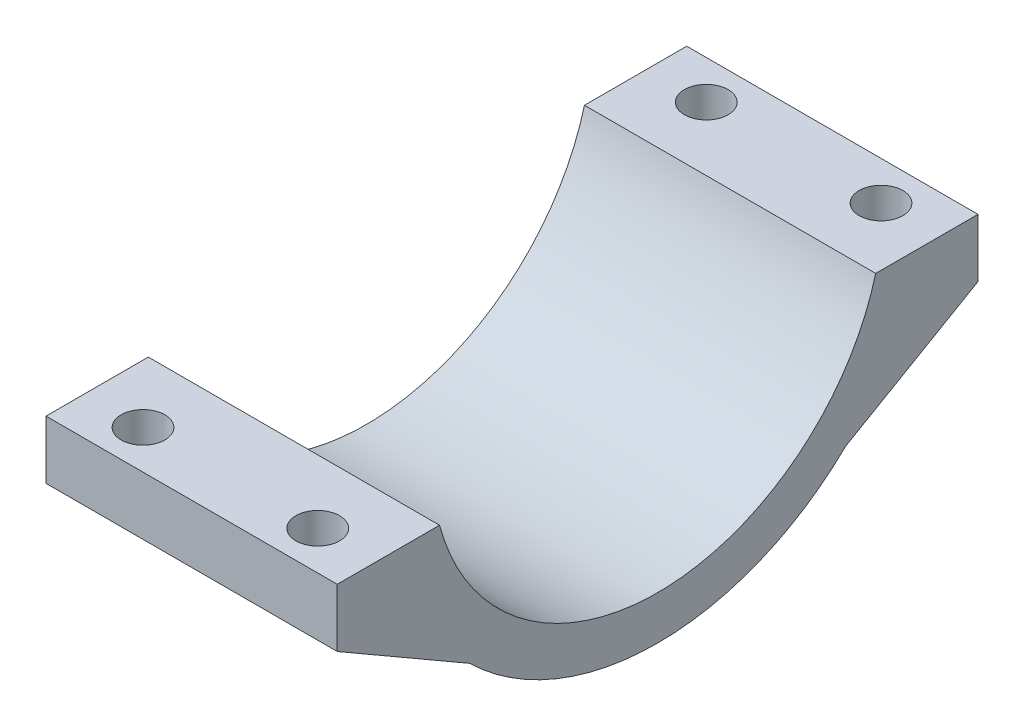
ISO-10303-21;
HEADER;
FILE_DESCRIPTION(('STEP AP214'),'2;1');
FILE_NAME('part.step','',(''),(''),'','','');
FILE_SCHEMA(('AUTOMOTIVE_DESIGN { 1 0 10303 214 1 1 1 1 }'));
ENDSEC;
DATA;
#1=APPLICATION_CONTEXT('core data for automotive mechanical design processes');
#2=APPLICATION_PROTOCOL_DEFINITION('international standard','automotive_design',2000,#1);
#3=PRODUCT_CONTEXT('',#1,'mechanical');
#4=PRODUCT('Part','Part','',(#3));
#5=PRODUCT_RELATED_PRODUCT_CATEGORY('part','',(#4));
#6=PRODUCT_DEFINITION_FORMATION('','',#4);
#7=PRODUCT_DEFINITION_CONTEXT('part definition',#1,'design');
#8=PRODUCT_DEFINITION('design','',#6,#7);
#9=PRODUCT_DEFINITION_SHAPE('','',#8);
#10=(LENGTH_UNIT() NAMED_UNIT(*) SI_UNIT(.MILLI.,.METRE.));
#11=(NAMED_UNIT(*) PLANE_ANGLE_UNIT() SI_UNIT($,.RADIAN.));
#12=(NAMED_UNIT(*) SI_UNIT($,.STERADIAN.) SOLID_ANGLE_UNIT());
#13=UNCERTAINTY_MEASURE_WITH_UNIT(LENGTH_MEASURE(1.E-05),#10,'distance_accuracy_value','');
#14=(GEOMETRIC_REPRESENTATION_CONTEXT(3) GLOBAL_UNCERTAINTY_ASSIGNED_CONTEXT((#13)) GLOBAL_UNIT_ASSIGNED_CONTEXT((#10,
#11,#12)) REPRESENTATION_CONTEXT('',''));
#15=CARTESIAN_POINT('',(0.,0.,0.));
#16=DIRECTION('',(0.,0.,1.));
#17=DIRECTION('',(1.,0.,0.));
#18=AXIS2_PLACEMENT_3D('',#15,#16,#17);
#19=CARTESIAN_POINT('',(20.,-8.,-16.6808273176123));
#20=DIRECTION('',(0.,1.,0.));
#21=DIRECTION('',(0.,0.,1.));
#22=AXIS2_PLACEMENT_3D('',#19,#20,#21);
#23=PLANE('',#22);
#24=CARTESIAN_POINT('',(16.,-8.,-19.3404136588061));
#25=DIRECTION('',(0.,-1.,0.));
#26=DIRECTION('',(0.,0.,-1.));
#27=AXIS2_PLACEMENT_3D('',#24,#25,#26);
#28=CIRCLE('',#27,1.5);
#29=CARTESIAN_POINT('',(16.,-8.,-20.8404136588061));
#30=VERTEX_POINT('',#29);
#31=EDGE_CURVE('E339',#30,#30,#28,.T.);
#32=ORIENTED_EDGE('',*,*,#31,.F.);
#33=EDGE_LOOP('',(#32));
#34=FACE_BOUND('',#33,.T.);
#35=DIRECTION('',(0.,0.,-1.));
#36=VECTOR('',#35,1.);
#37=CARTESIAN_POINT('',(18.8,-8.,-16.6808273176123));
#38=LINE('',#37,#36);
#39=CARTESIAN_POINT('',(18.8,-8.,-16.6808273176123));
#40=VERTEX_POINT('',#39);
#41=CARTESIAN_POINT('',(18.8,-8.,-22.));
#42=VERTEX_POINT('',#41);
#43=EDGE_CURVE('E173',#40,#42,#38,.T.);
#44=ORIENTED_EDGE('',*,*,#43,.F.);
#45=DIRECTION('',(-1.,0.,0.));
#46=VECTOR('',#45,1.);
#47=CARTESIAN_POINT('',(20.,-8.00000000000001,-16.6808273176123));
#48=LINE('',#47,#46);
#49=CARTESIAN_POINT('',(13.,-8.00000000000001,-16.6808273176123));
#50=VERTEX_POINT('',#49);
#51=EDGE_CURVE('E225',#40,#50,#48,.T.);
#52=ORIENTED_EDGE('',*,*,#51,.T.);
#53=DIRECTION('',(0.,0.,1.));
#54=VECTOR('',#53,1.);
#55=CARTESIAN_POINT('',(13.,-8.,-16.6808273176123));
#56=LINE('',#55,#54);
#57=CARTESIAN_POINT('',(13.,-7.99999999999999,-22.));
#58=VERTEX_POINT('',#57);
#59=EDGE_CURVE('E194',#58,#50,#56,.T.);
#60=ORIENTED_EDGE('',*,*,#59,.F.);
#61=DIRECTION('',(-1.,0.,0.));
#62=VECTOR('',#61,1.);
#63=CARTESIAN_POINT('',(20.,-7.99999999999999,-22.));
#64=LINE('',#63,#62);
#65=EDGE_CURVE('E57',#42,#58,#64,.T.);
#66=ORIENTED_EDGE('',*,*,#65,.F.);
#67=EDGE_LOOP('',(#44,#52,#60,#66));
#68=FACE_BOUND('',#67,.T.);
#69=ADVANCED_FACE('F33',(#34,#68),#23,.F.);
#70=CARTESIAN_POINT('',(4.,-8.,-19.3404136588061));
#71=DIRECTION('',(0.,-1.,0.));
#72=DIRECTION('',(0.,0.,-1.));
#73=AXIS2_PLACEMENT_3D('',#70,#71,#72);
#74=CIRCLE('',#73,1.5);
#75=CARTESIAN_POINT('',(4.,-8.,-20.8404136588061));
#76=VERTEX_POINT('',#75);
#77=EDGE_CURVE('E336',#76,#76,#74,.T.);
#78=ORIENTED_EDGE('',*,*,#77,.F.);
#79=EDGE_LOOP('',(#78));
#80=FACE_BOUND('',#79,.T.);
#81=CARTESIAN_POINT('',(7.,-7.99999999999999,-22.));
#82=VERTEX_POINT('',#81);
#83=CARTESIAN_POINT('',(1.2,-7.99999999999999,-22.));
#84=VERTEX_POINT('',#83);
#85=EDGE_CURVE('E50',#82,#84,#64,.T.);
#86=ORIENTED_EDGE('',*,*,#85,.F.);
#87=DIRECTION('',(0.,0.,1.));
#88=VECTOR('',#87,1.);
#89=CARTESIAN_POINT('',(7.,-8.,-16.6808273176123));
#90=LINE('',#89,#88);
#91=CARTESIAN_POINT('',(7.,-8.00000000000001,-16.6808273176123));
#92=VERTEX_POINT('',#91);
#93=EDGE_CURVE('E320',#82,#92,#90,.T.);
#94=ORIENTED_EDGE('',*,*,#93,.T.);
#95=CARTESIAN_POINT('',(1.2,-8.00000000000001,-16.6808273176123));
#96=VERTEX_POINT('',#95);
#97=EDGE_CURVE('E227',#92,#96,#48,.T.);
#98=ORIENTED_EDGE('',*,*,#97,.T.);
#99=DIRECTION('',(0.,0.,1.));
#100=VECTOR('',#99,1.);
#101=CARTESIAN_POINT('',(1.2,-8.,-16.6808273176123));
#102=LINE('',#101,#100);
#103=EDGE_CURVE('E306',#84,#96,#102,.T.);
#104=ORIENTED_EDGE('',*,*,#103,.F.);
#105=EDGE_LOOP('',(#86,#94,#98,#104));
#106=FACE_BOUND('',#105,.T.);
#107=ADVANCED_FACE('F35',(#80,#106),#23,.F.);
#108=CARTESIAN_POINT('',(20.,-8.,22.));
#109=DIRECTION('',(0.,1.,0.));
#110=DIRECTION('',(0.,0.,1.));
#111=AXIS2_PLACEMENT_3D('',#108,#109,#110);
#112=PLANE('',#111);
#113=CARTESIAN_POINT('',(16.,-8.,19.3404136588061));
#114=DIRECTION('',(0.,-1.,0.));
#115=DIRECTION('',(0.,0.,-1.));
#116=AXIS2_PLACEMENT_3D('',#113,#114,#115);
#117=CIRCLE('',#116,1.5);
#118=CARTESIAN_POINT('',(16.,-8.,17.8404136588061));
#119=VERTEX_POINT('',#118);
#120=EDGE_CURVE('E297',#119,#119,#117,.T.);
#121=ORIENTED_EDGE('',*,*,#120,.F.);
#122=EDGE_LOOP('',(#121));
#123=FACE_BOUND('',#122,.T.);
#124=DIRECTION('',(0.,0.,-1.));
#125=VECTOR('',#124,1.);
#126=CARTESIAN_POINT('',(18.8,-8.,22.));
#127=LINE('',#126,#125);
#128=CARTESIAN_POINT('',(18.8,-8.,22.));
#129=VERTEX_POINT('',#128);
#130=CARTESIAN_POINT('',(18.8,-8.,16.6808273176123));
#131=VERTEX_POINT('',#130);
#132=EDGE_CURVE('E280',#129,#131,#127,.T.);
#133=ORIENTED_EDGE('',*,*,#132,.F.);
#134=DIRECTION('',(-1.,0.,0.));
#135=VECTOR('',#134,1.);
#136=CARTESIAN_POINT('',(20.,-8.,22.));
#137=LINE('',#136,#135);
#138=CARTESIAN_POINT('',(13.,-8.,22.));
#139=VERTEX_POINT('',#138);
#140=EDGE_CURVE('E220',#129,#139,#137,.T.);
#141=ORIENTED_EDGE('',*,*,#140,.T.);
#142=DIRECTION('',(0.,0.,1.));
#143=VECTOR('',#142,1.);
#144=CARTESIAN_POINT('',(13.,-8.,22.));
#145=LINE('',#144,#143);
#146=CARTESIAN_POINT('',(13.,-8.,16.6808273176123));
#147=VERTEX_POINT('',#146);
#148=EDGE_CURVE('E273',#147,#139,#145,.T.);
#149=ORIENTED_EDGE('',*,*,#148,.F.);
#150=DIRECTION('',(-1.,0.,0.));
#151=VECTOR('',#150,1.);
#152=CARTESIAN_POINT('',(20.,-8.,16.6808273176123));
#153=LINE('',#152,#151);
#154=EDGE_CURVE('E222',#131,#147,#153,.T.);
#155=ORIENTED_EDGE('',*,*,#154,.F.);
#156=EDGE_LOOP('',(#133,#141,#149,#155));
#157=FACE_BOUND('',#156,.T.);
#158=ADVANCED_FACE('F363',(#123,#157),#112,.F.);
#159=CARTESIAN_POINT('',(4.,-8.,19.3404136588061));
#160=DIRECTION('',(0.,-1.,0.));
#161=DIRECTION('',(0.,0.,-1.));
#162=AXIS2_PLACEMENT_3D('',#159,#160,#161);
#163=CIRCLE('',#162,1.5);
#164=CARTESIAN_POINT('',(4.,-8.,17.8404136588061));
#165=VERTEX_POINT('',#164);
#166=EDGE_CURVE('E293',#165,#165,#163,.T.);
#167=ORIENTED_EDGE('',*,*,#166,.F.);
#168=EDGE_LOOP('',(#167));
#169=FACE_BOUND('',#168,.T.);
#170=CARTESIAN_POINT('',(7.,-8.,16.6808273176123));
#171=VERTEX_POINT('',#170);
#172=CARTESIAN_POINT('',(1.2,-8.,16.6808273176123));
#173=VERTEX_POINT('',#172);
#174=EDGE_CURVE('E224',#171,#173,#153,.T.);
#175=ORIENTED_EDGE('',*,*,#174,.F.);
#176=DIRECTION('',(0.,0.,1.));
#177=VECTOR('',#176,1.);
#178=CARTESIAN_POINT('',(7.,-8.,22.));
#179=LINE('',#178,#177);
#180=CARTESIAN_POINT('',(7.,-8.,22.));
#181=VERTEX_POINT('',#180);
#182=EDGE_CURVE('E271',#171,#181,#179,.T.);
#183=ORIENTED_EDGE('',*,*,#182,.T.);
#184=CARTESIAN_POINT('',(1.2,-8.,22.));
#185=VERTEX_POINT('',#184);
#186=EDGE_CURVE('E221',#181,#185,#137,.T.);
#187=ORIENTED_EDGE('',*,*,#186,.T.);
#188=DIRECTION('',(0.,0.,1.));
#189=VECTOR('',#188,1.);
#190=CARTESIAN_POINT('',(1.2,-8.,22.));
#191=LINE('',#190,#189);
#192=EDGE_CURVE('E242',#173,#185,#191,.T.);
#193=ORIENTED_EDGE('',*,*,#192,.F.);
#194=EDGE_LOOP('',(#175,#183,#187,#193));
#195=FACE_BOUND('',#194,.T.);
#196=ADVANCED_FACE('F368',(#169,#195),#112,.F.);
#197=CARTESIAN_POINT('',(20.,-3.99999999999999,-22.));
#198=DIRECTION('',(0.,0.,1.));
#199=DIRECTION('',(1.,0.,0.));
#200=AXIS2_PLACEMENT_3D('',#197,#198,#199);
#201=PLANE('',#200);
#202=CARTESIAN_POINT('',(20.,-7.99999999999999,-22.));
#203=VERTEX_POINT('',#202);
#204=EDGE_CURVE('E187',#203,#42,#64,.T.);
#205=ORIENTED_EDGE('',*,*,#204,.T.);
#206=ORIENTED_EDGE('',*,*,#65,.T.);
#207=DIRECTION('',(1.,0.,0.));
#208=VECTOR('',#207,1.);
#209=CARTESIAN_POINT('',(20.,-8.,-22.));
#210=LINE('',#209,#208);
#211=EDGE_CURVE('E315',#82,#58,#210,.T.);
#212=ORIENTED_EDGE('',*,*,#211,.F.);
#213=ORIENTED_EDGE('',*,*,#85,.T.);
#214=DIRECTION('',(1.,0.,0.));
#215=VECTOR('',#214,1.);
#216=CARTESIAN_POINT('',(20.,-8.,-22.));
#217=LINE('',#216,#215);
#218=CARTESIAN_POINT('',(0.,-7.99999999999999,-22.));
#219=VERTEX_POINT('',#218);
#220=EDGE_CURVE('E300',#219,#84,#217,.T.);
#221=ORIENTED_EDGE('',*,*,#220,.F.);
#222=DIRECTION('',(0.,1.,0.));
#223=VECTOR('',#222,1.);
#224=CARTESIAN_POINT('',(0.,-3.99999999999999,-22.));
#225=LINE('',#224,#223);
#226=CARTESIAN_POINT('',(0.,-3.99999999999999,-22.));
#227=VERTEX_POINT('',#226);
#228=EDGE_CURVE('E240',#219,#227,#225,.T.);
#229=ORIENTED_EDGE('',*,*,#228,.T.);
#230=DIRECTION('',(-1.,0.,0.));
#231=VECTOR('',#230,1.);
#232=CARTESIAN_POINT('',(20.,-3.99999999999999,-22.));
#233=LINE('',#232,#231);
#234=CARTESIAN_POINT('',(20.,-3.99999999999999,-22.));
#235=VERTEX_POINT('',#234);
#236=EDGE_CURVE('E205',#235,#227,#233,.T.);
#237=ORIENTED_EDGE('',*,*,#236,.F.);
#238=DIRECTION('',(0.,1.,0.));
#239=VECTOR('',#238,1.);
#240=CARTESIAN_POINT('',(20.,-3.99999999999999,-22.));
#241=LINE('',#240,#239);
#242=EDGE_CURVE('E199',#203,#235,#241,.T.);
#243=ORIENTED_EDGE('',*,*,#242,.F.);
#244=EDGE_LOOP('',(#205,#206,#212,#213,#221,#229,#237,#243));
#245=FACE_BOUND('',#244,.T.);
#246=ADVANCED_FACE('F197',(#245),#201,.F.);
#247=CARTESIAN_POINT('',(20.,-3.99999999999999,-14.9749791318719));
#248=DIRECTION('',(0.,-1.,0.));
#249=DIRECTION('',(0.,0.,-1.));
#250=AXIS2_PLACEMENT_3D('',#247,#248,#249);
#251=PLANE('',#250);
#252=CARTESIAN_POINT('',(16.,-3.99999999999999,-19.3404136588061));
#253=DIRECTION('',(0.,-1.,0.));
#254=DIRECTION('',(0.,0.,-1.));
#255=AXIS2_PLACEMENT_3D('',#252,#253,#254);
#256=CIRCLE('',#255,1.5);
#257=CARTESIAN_POINT('',(16.,-3.99999999999999,-20.8404136588061));
#258=VERTEX_POINT('',#257);
#259=EDGE_CURVE('E37',#258,#258,#256,.T.);
#260=ORIENTED_EDGE('',*,*,#259,.T.);
#261=EDGE_LOOP('',(#260));
#262=FACE_BOUND('',#261,.T.);
#263=CARTESIAN_POINT('',(4.,-3.99999999999999,-19.3404136588061));
#264=DIRECTION('',(0.,-1.,0.));
#265=DIRECTION('',(0.,0.,-1.));
#266=AXIS2_PLACEMENT_3D('',#263,#264,#265);
#267=CIRCLE('',#266,1.5);
#268=CARTESIAN_POINT('',(4.,-3.99999999999999,-20.8404136588061));
#269=VERTEX_POINT('',#268);
#270=EDGE_CURVE('E191',#269,#269,#267,.T.);
#271=ORIENTED_EDGE('',*,*,#270,.T.);
#272=EDGE_LOOP('',(#271));
#273=FACE_BOUND('',#272,.T.);
#274=ORIENTED_EDGE('',*,*,#236,.T.);
#275=DIRECTION('',(0.,0.,1.));
#276=VECTOR('',#275,1.);
#277=CARTESIAN_POINT('',(0.,-3.99999999999999,-14.9749791318719));
#278=LINE('',#277,#276);
#279=CARTESIAN_POINT('',(0.,-3.99999999999999,-14.9749791318719));
#280=VERTEX_POINT('',#279);
#281=EDGE_CURVE('E238',#227,#280,#278,.T.);
#282=ORIENTED_EDGE('',*,*,#281,.T.);
#283=DIRECTION('',(-1.,0.,0.));
#284=VECTOR('',#283,1.);
#285=CARTESIAN_POINT('',(20.,-3.99999999999999,-14.9749791318719));
#286=LINE('',#285,#284);
#287=CARTESIAN_POINT('',(20.,-3.99999999999999,-14.9749791318719));
#288=VERTEX_POINT('',#287);
#289=EDGE_CURVE('E207',#288,#280,#286,.T.);
#290=ORIENTED_EDGE('',*,*,#289,.F.);
#291=DIRECTION('',(0.,0.,1.));
#292=VECTOR('',#291,1.);
#293=CARTESIAN_POINT('',(20.,-3.99999999999999,-14.9749791318719));
#294=LINE('',#293,#292);
#295=EDGE_CURVE('E252',#235,#288,#294,.T.);
#296=ORIENTED_EDGE('',*,*,#295,.F.);
#297=EDGE_LOOP('',(#274,#282,#290,#296));
#298=FACE_BOUND('',#297,.T.);
#299=ADVANCED_FACE('F346',(#262,#273,#298),#251,.F.);
#300=CARTESIAN_POINT('',(20.,0.,0.));
#301=DIRECTION('',(-1.,0.,0.));
#302=DIRECTION('',(0.,0.,1.));
#303=AXIS2_PLACEMENT_3D('',#300,#301,#302);
#304=CYLINDRICAL_SURFACE('',#303,15.5);
#305=ORIENTED_EDGE('',*,*,#289,.T.);
#306=CARTESIAN_POINT('',(0.,0.,0.));
#307=DIRECTION('',(-1.,0.,0.));
#308=DIRECTION('',(0.,0.,-1.));
#309=AXIS2_PLACEMENT_3D('',#306,#307,#308);
#310=CIRCLE('',#309,15.5);
#311=CARTESIAN_POINT('',(0.,-3.99999999999999,14.9749791318719));
#312=VERTEX_POINT('',#311);
#313=EDGE_CURVE('E235',#280,#312,#310,.T.);
#314=ORIENTED_EDGE('',*,*,#313,.T.);
#315=DIRECTION('',(-1.,0.,0.));
#316=VECTOR('',#315,1.);
#317=CARTESIAN_POINT('',(20.,-3.99999999999999,14.9749791318719));
#318=LINE('',#317,#316);
#319=CARTESIAN_POINT('',(20.,-3.99999999999999,14.9749791318719));
#320=VERTEX_POINT('',#319);
#321=EDGE_CURVE('E212',#320,#312,#318,.T.);
#322=ORIENTED_EDGE('',*,*,#321,.F.);
#323=CARTESIAN_POINT('',(20.,0.,0.));
#324=DIRECTION('',(-1.,0.,0.));
#325=DIRECTION('',(0.,0.,-1.));
#326=AXIS2_PLACEMENT_3D('',#323,#324,#325);
#327=CIRCLE('',#326,15.5);
#328=EDGE_CURVE('E250',#288,#320,#327,.T.);
#329=ORIENTED_EDGE('',*,*,#328,.F.);
#330=EDGE_LOOP('',(#305,#314,#322,#329));
#331=FACE_BOUND('',#330,.T.);
#332=ADVANCED_FACE('F498',(#331),#304,.F.);
#333=CARTESIAN_POINT('',(20.,-4.,22.));
#334=DIRECTION('',(0.,-1.,0.));
#335=DIRECTION('',(0.,0.,-1.));
#336=AXIS2_PLACEMENT_3D('',#333,#334,#335);
#337=PLANE('',#336);
#338=ORIENTED_EDGE('',*,*,#321,.T.);
#339=DIRECTION('',(0.,0.,1.));
#340=VECTOR('',#339,1.);
#341=CARTESIAN_POINT('',(0.,-4.,22.));
#342=LINE('',#341,#340);
#343=CARTESIAN_POINT('',(0.,-4.,22.));
#344=VERTEX_POINT('',#343);
#345=EDGE_CURVE('E232',#312,#344,#342,.T.);
#346=ORIENTED_EDGE('',*,*,#345,.T.);
#347=DIRECTION('',(-1.,0.,0.));
#348=VECTOR('',#347,1.);
#349=CARTESIAN_POINT('',(20.,-4.,22.));
#350=LINE('',#349,#348);
#351=CARTESIAN_POINT('',(20.,-4.,22.));
#352=VERTEX_POINT('',#351);
#353=EDGE_CURVE('E216',#352,#344,#350,.T.);
#354=ORIENTED_EDGE('',*,*,#353,.F.);
#355=DIRECTION('',(0.,0.,1.));
#356=VECTOR('',#355,1.);
#357=CARTESIAN_POINT('',(20.,-4.,22.));
#358=LINE('',#357,#356);
#359=EDGE_CURVE('E248',#320,#352,#358,.T.);
#360=ORIENTED_EDGE('',*,*,#359,.F.);
#361=EDGE_LOOP('',(#338,#346,#354,#360));
#362=FACE_BOUND('',#361,.T.);
#363=CARTESIAN_POINT('',(16.,-4.,19.3404136588061));
#364=DIRECTION('',(0.,-1.,0.));
#365=DIRECTION('',(0.,0.,-1.));
#366=AXIS2_PLACEMENT_3D('',#363,#364,#365);
#367=CIRCLE('',#366,1.5);
#368=CARTESIAN_POINT('',(16.,-4.,17.8404136588061));
#369=VERTEX_POINT('',#368);
#370=EDGE_CURVE('E296',#369,#369,#367,.T.);
#371=ORIENTED_EDGE('',*,*,#370,.T.);
#372=EDGE_LOOP('',(#371));
#373=FACE_BOUND('',#372,.T.);
#374=CARTESIAN_POINT('',(4.,-4.,19.3404136588061));
#375=DIRECTION('',(0.,-1.,0.));
#376=DIRECTION('',(0.,0.,-1.));
#377=AXIS2_PLACEMENT_3D('',#374,#375,#376);
#378=CIRCLE('',#377,1.5);
#379=CARTESIAN_POINT('',(4.,-4.,17.8404136588061));
#380=VERTEX_POINT('',#379);
#381=EDGE_CURVE('E291',#380,#380,#378,.T.);
#382=ORIENTED_EDGE('',*,*,#381,.T.);
#383=EDGE_LOOP('',(#382));
#384=FACE_BOUND('',#383,.T.);
#385=ADVANCED_FACE('F494',(#362,#373,#384),#337,.F.);
#386=CARTESIAN_POINT('',(20.,-4.,22.));
#387=DIRECTION('',(0.,0.,-1.));
#388=DIRECTION('',(-1.,0.,0.));
#389=AXIS2_PLACEMENT_3D('',#386,#387,#388);
#390=PLANE('',#389);
#391=ORIENTED_EDGE('',*,*,#353,.T.);
#392=DIRECTION('',(0.,-1.,0.));
#393=VECTOR('',#392,1.);
#394=CARTESIAN_POINT('',(0.,-4.,22.));
#395=LINE('',#394,#393);
#396=CARTESIAN_POINT('',(0.,-8.,22.));
#397=VERTEX_POINT('',#396);
#398=EDGE_CURVE('E230',#344,#397,#395,.T.);
#399=ORIENTED_EDGE('',*,*,#398,.T.);
#400=DIRECTION('',(-1.,0.,0.));
#401=VECTOR('',#400,1.);
#402=CARTESIAN_POINT('',(20.,-8.,22.));
#403=LINE('',#402,#401);
#404=EDGE_CURVE('E257',#397,#185,#403,.F.);
#405=ORIENTED_EDGE('',*,*,#404,.T.);
#406=ORIENTED_EDGE('',*,*,#186,.F.);
#407=DIRECTION('',(1.,0.,0.));
#408=VECTOR('',#407,1.);
#409=CARTESIAN_POINT('',(20.,-8.,22.));
#410=LINE('',#409,#408);
#411=EDGE_CURVE('E266',#139,#181,#410,.F.);
#412=ORIENTED_EDGE('',*,*,#411,.F.);
#413=ORIENTED_EDGE('',*,*,#140,.F.);
#414=CARTESIAN_POINT('',(20.,-8.,22.));
#415=VERTEX_POINT('',#414);
#416=EDGE_CURVE('E218',#415,#129,#137,.T.);
#417=ORIENTED_EDGE('',*,*,#416,.F.);
#418=DIRECTION('',(0.,-1.,0.));
#419=VECTOR('',#418,1.);
#420=CARTESIAN_POINT('',(20.,-4.,22.));
#421=LINE('',#420,#419);
#422=EDGE_CURVE('E245',#352,#415,#421,.T.);
#423=ORIENTED_EDGE('',*,*,#422,.F.);
#424=EDGE_LOOP('',(#391,#399,#405,#406,#412,#413,#417,#423));
#425=FACE_BOUND('',#424,.T.);
#426=ADVANCED_FACE('F488',(#425),#390,.F.);
#427=CARTESIAN_POINT('',(20.,0.,0.));
#428=DIRECTION('',(-1.,0.,0.));
#429=DIRECTION('',(0.,0.,1.));
#430=AXIS2_PLACEMENT_3D('',#427,#428,#429);
#431=CYLINDRICAL_SURFACE('',#430,18.5);
#432=DIRECTION('',(-1.,0.,0.));
#433=VECTOR('',#432,1.);
#434=CARTESIAN_POINT('',(20.,-13.2443105037411,-12.9165877568533));
#435=LINE('',#434,#433);
#436=CARTESIAN_POINT('',(18.8,-13.2443105037411,-12.9165877568533));
#437=VERTEX_POINT('',#436);
#438=CARTESIAN_POINT('',(20.,-13.2443105037411,-12.9165877568533));
#439=VERTEX_POINT('',#438);
#440=EDGE_CURVE('E190',#437,#439,#435,.F.);
#441=ORIENTED_EDGE('',*,*,#440,.T.);
#442=CARTESIAN_POINT('',(20.,0.,0.));
#443=DIRECTION('',(1.,0.,0.));
#444=DIRECTION('',(0.,0.,-1.));
#445=AXIS2_PLACEMENT_3D('',#442,#443,#444);
#446=CIRCLE('',#445,18.5);
#447=CARTESIAN_POINT('',(20.,-13.2443105037411,12.9165877568533));
#448=VERTEX_POINT('',#447);
#449=EDGE_CURVE('E243',#448,#439,#446,.T.);
#450=ORIENTED_EDGE('',*,*,#449,.F.);
#451=DIRECTION('',(-1.,0.,0.));
#452=VECTOR('',#451,1.);
#453=CARTESIAN_POINT('',(20.,-13.2443105037411,12.9165877568533));
#454=LINE('',#453,#452);
#455=CARTESIAN_POINT('',(18.8,-13.2443105037411,12.9165877568533));
#456=VERTEX_POINT('',#455);
#457=EDGE_CURVE('E284',#448,#456,#454,.T.);
#458=ORIENTED_EDGE('',*,*,#457,.T.);
#459=CARTESIAN_POINT('',(18.8,0.,0.));
#460=DIRECTION('',(1.,0.,0.));
#461=DIRECTION('',(0.,0.,-1.));
#462=AXIS2_PLACEMENT_3D('',#459,#460,#461);
#463=CIRCLE('',#462,18.5);
#464=EDGE_CURVE('E42',#131,#456,#463,.T.);
#465=ORIENTED_EDGE('',*,*,#464,.F.);
#466=ORIENTED_EDGE('',*,*,#154,.T.);
#467=CARTESIAN_POINT('',(13.,0.,0.));
#468=DIRECTION('',(-1.,0.,0.));
#469=DIRECTION('',(0.,0.,1.));
#470=AXIS2_PLACEMENT_3D('',#467,#468,#469);
#471=CIRCLE('',#470,18.5);
#472=CARTESIAN_POINT('',(13.,-13.2443105037411,12.9165877568533));
#473=VERTEX_POINT('',#472);
#474=EDGE_CURVE('E202',#473,#147,#471,.T.);
#475=ORIENTED_EDGE('',*,*,#474,.F.);
#476=DIRECTION('',(-1.,0.,0.));
#477=VECTOR('',#476,1.);
#478=CARTESIAN_POINT('',(20.,-13.2443105037411,12.9165877568533));
#479=LINE('',#478,#477);
#480=CARTESIAN_POINT('',(7.,-13.2443105037411,12.9165877568533));
#481=VERTEX_POINT('',#480);
#482=EDGE_CURVE('E383',#473,#481,#479,.T.);
#483=ORIENTED_EDGE('',*,*,#482,.T.);
#484=CARTESIAN_POINT('',(7.,0.,0.));
#485=DIRECTION('',(-1.,0.,0.));
#486=DIRECTION('',(0.,0.,1.));
#487=AXIS2_PLACEMENT_3D('',#484,#485,#486);
#488=CIRCLE('',#487,18.5);
#489=EDGE_CURVE('E381',#481,#171,#488,.T.);
#490=ORIENTED_EDGE('',*,*,#489,.T.);
#491=ORIENTED_EDGE('',*,*,#174,.T.);
#492=CARTESIAN_POINT('',(1.2,0.,0.));
#493=DIRECTION('',(-1.,0.,0.));
#494=DIRECTION('',(0.,0.,1.));
#495=AXIS2_PLACEMENT_3D('',#492,#493,#494);
#496=CIRCLE('',#495,18.5);
#497=CARTESIAN_POINT('',(1.2,-13.2443105037411,12.9165877568533));
#498=VERTEX_POINT('',#497);
#499=EDGE_CURVE('E200',#498,#173,#496,.T.);
#500=ORIENTED_EDGE('',*,*,#499,.F.);
#501=DIRECTION('',(-1.,0.,0.));
#502=VECTOR('',#501,1.);
#503=CARTESIAN_POINT('',(20.,-13.2443105037411,12.9165877568533));
#504=LINE('',#503,#502);
#505=CARTESIAN_POINT('',(0.,-13.2443105037411,12.9165877568533));
#506=VERTEX_POINT('',#505);
#507=EDGE_CURVE('E260',#498,#506,#504,.T.);
#508=ORIENTED_EDGE('',*,*,#507,.T.);
#509=CARTESIAN_POINT('',(0.,0.,0.));
#510=DIRECTION('',(1.,0.,0.));
#511=DIRECTION('',(0.,0.,-1.));
#512=AXIS2_PLACEMENT_3D('',#509,#510,#511);
#513=CIRCLE('',#512,18.5);
#514=CARTESIAN_POINT('',(0.,-13.2443105037411,-12.9165877568533));
#515=VERTEX_POINT('',#514);
#516=EDGE_CURVE('E228',#506,#515,#513,.T.);
#517=ORIENTED_EDGE('',*,*,#516,.T.);
#518=DIRECTION('',(-1.,0.,0.));
#519=VECTOR('',#518,1.);
#520=CARTESIAN_POINT('',(20.,-13.2443105037411,-12.9165877568533));
#521=LINE('',#520,#519);
#522=CARTESIAN_POINT('',(1.2,-13.2443105037411,-12.9165877568533));
#523=VERTEX_POINT('',#522);
#524=EDGE_CURVE('E303',#515,#523,#521,.F.);
#525=ORIENTED_EDGE('',*,*,#524,.T.);
#526=CARTESIAN_POINT('',(1.2,0.,0.));
#527=DIRECTION('',(-1.,0.,0.));
#528=DIRECTION('',(0.,0.,1.));
#529=AXIS2_PLACEMENT_3D('',#526,#527,#528);
#530=CIRCLE('',#529,18.5);
#531=EDGE_CURVE('E305',#96,#523,#530,.T.);
#532=ORIENTED_EDGE('',*,*,#531,.F.);
#533=ORIENTED_EDGE('',*,*,#97,.F.);
#534=CARTESIAN_POINT('',(7.,0.,0.));
#535=DIRECTION('',(-1.,0.,0.));
#536=DIRECTION('',(0.,0.,1.));
#537=AXIS2_PLACEMENT_3D('',#534,#535,#536);
#538=CIRCLE('',#537,18.5);
#539=CARTESIAN_POINT('',(7.,-13.2443105037411,-12.9165877568533));
#540=VERTEX_POINT('',#539);
#541=EDGE_CURVE('E319',#92,#540,#538,.T.);
#542=ORIENTED_EDGE('',*,*,#541,.T.);
#543=DIRECTION('',(-1.,0.,0.));
#544=VECTOR('',#543,1.);
#545=CARTESIAN_POINT('',(20.,-13.2443105037411,-12.9165877568533));
#546=LINE('',#545,#544);
#547=CARTESIAN_POINT('',(13.,-13.2443105037411,-12.9165877568533));
#548=VERTEX_POINT('',#547);
#549=EDGE_CURVE('E11',#540,#548,#546,.F.);
#550=ORIENTED_EDGE('',*,*,#549,.T.);
#551=CARTESIAN_POINT('',(13.,0.,0.));
#552=DIRECTION('',(-1.,0.,0.));
#553=DIRECTION('',(0.,0.,1.));
#554=AXIS2_PLACEMENT_3D('',#551,#552,#553);
#555=CIRCLE('',#554,18.5);
#556=EDGE_CURVE('E322',#50,#548,#555,.T.);
#557=ORIENTED_EDGE('',*,*,#556,.F.);
#558=ORIENTED_EDGE('',*,*,#51,.F.);
#559=CARTESIAN_POINT('',(18.8,0.,0.));
#560=DIRECTION('',(1.,0.,0.));
#561=DIRECTION('',(0.,0.,-1.));
#562=AXIS2_PLACEMENT_3D('',#559,#560,#561);
#563=CIRCLE('',#562,18.5);
#564=EDGE_CURVE('E178',#437,#40,#563,.T.);
#565=ORIENTED_EDGE('',*,*,#564,.F.);
#566=EDGE_LOOP('',(#441,#450,#458,#465,#466,#475,#483,#490,#491,#500,#508,#517,#525,#532,#533,
#542,#550,#557,#558,#565));
#567=FACE_BOUND('',#566,.T.);
#568=ADVANCED_FACE('F392',(#567),#431,.T.);
#569=CARTESIAN_POINT('',(20.,0.,0.));
#570=DIRECTION('',(1.,0.,0.));
#571=DIRECTION('',(0.,0.,-1.));
#572=AXIS2_PLACEMENT_3D('',#569,#570,#571);
#573=PLANE('',#572);
#574=ORIENTED_EDGE('',*,*,#449,.T.);
#575=DIRECTION('',(0.,-0.500000000000002,0.866025403784438));
#576=VECTOR('',#575,1.);
#577=CARTESIAN_POINT('',(20.,-8.,-22.));
#578=LINE('',#577,#576);
#579=EDGE_CURVE('E181',#203,#439,#578,.T.);
#580=ORIENTED_EDGE('',*,*,#579,.F.);
#581=ORIENTED_EDGE('',*,*,#242,.T.);
#582=ORIENTED_EDGE('',*,*,#295,.T.);
#583=ORIENTED_EDGE('',*,*,#328,.T.);
#584=ORIENTED_EDGE('',*,*,#359,.T.);
#585=ORIENTED_EDGE('',*,*,#422,.T.);
#586=DIRECTION('',(0.,-0.500000000000002,-0.866025403784438));
#587=VECTOR('',#586,1.);
#588=CARTESIAN_POINT('',(20.,-8.,22.));
#589=LINE('',#588,#587);
#590=EDGE_CURVE('E287',#415,#448,#589,.T.);
#591=ORIENTED_EDGE('',*,*,#590,.T.);
#592=EDGE_LOOP('',(#574,#580,#581,#582,#583,#584,#585,#591));
#593=FACE_BOUND('',#592,.T.);
#594=ADVANCED_FACE('F481',(#593),#573,.T.);
#595=CARTESIAN_POINT('',(0.,0.,0.));
#596=DIRECTION('',(1.,0.,0.));
#597=DIRECTION('',(0.,0.,-1.));
#598=AXIS2_PLACEMENT_3D('',#595,#596,#597);
#599=PLANE('',#598);
#600=DIRECTION('',(0.,-0.500000000000002,0.866025403784438));
#601=VECTOR('',#600,1.);
#602=CARTESIAN_POINT('',(0.,-8.,-22.));
#603=LINE('',#602,#601);
#604=EDGE_CURVE('E309',#219,#515,#603,.T.);
#605=ORIENTED_EDGE('',*,*,#604,.T.);
#606=ORIENTED_EDGE('',*,*,#516,.F.);
#607=DIRECTION('',(0.,-0.500000000000002,-0.866025403784438));
#608=VECTOR('',#607,1.);
#609=CARTESIAN_POINT('',(0.,-8.,22.));
#610=LINE('',#609,#608);
#611=EDGE_CURVE('E262',#397,#506,#610,.T.);
#612=ORIENTED_EDGE('',*,*,#611,.F.);
#613=ORIENTED_EDGE('',*,*,#398,.F.);
#614=ORIENTED_EDGE('',*,*,#345,.F.);
#615=ORIENTED_EDGE('',*,*,#313,.F.);
#616=ORIENTED_EDGE('',*,*,#281,.F.);
#617=ORIENTED_EDGE('',*,*,#228,.F.);
#618=EDGE_LOOP('',(#605,#606,#612,#613,#614,#615,#616,#617));
#619=FACE_BOUND('',#618,.T.);
#620=ADVANCED_FACE('F418',(#619),#599,.F.);
#621=CARTESIAN_POINT('',(1.2,-11.25,0.));
#622=DIRECTION('',(-1.,0.,0.));
#623=DIRECTION('',(0.,0.,1.));
#624=AXIS2_PLACEMENT_3D('',#621,#622,#623);
#625=PLANE('',#624);
#626=ORIENTED_EDGE('',*,*,#499,.T.);
#627=ORIENTED_EDGE('',*,*,#192,.T.);
#628=DIRECTION('',(0.,-0.500000000000002,-0.866025403784438));
#629=VECTOR('',#628,1.);
#630=CARTESIAN_POINT('',(1.2,-8.,22.));
#631=LINE('',#630,#629);
#632=EDGE_CURVE('E263',#185,#498,#631,.T.);
#633=ORIENTED_EDGE('',*,*,#632,.T.);
#634=EDGE_LOOP('',(#626,#627,#633));
#635=FACE_BOUND('',#634,.T.);
#636=ADVANCED_FACE('F409',(#635),#625,.F.);
#637=CARTESIAN_POINT('',(0.,-8.,22.));
#638=DIRECTION('',(0.,0.866025403784438,-0.500000000000002));
#639=DIRECTION('',(0.,-0.500000000000002,-0.866025403784438));
#640=AXIS2_PLACEMENT_3D('',#637,#638,#639);
#641=PLANE('',#640);
#642=ORIENTED_EDGE('',*,*,#404,.F.);
#643=ORIENTED_EDGE('',*,*,#611,.T.);
#644=ORIENTED_EDGE('',*,*,#507,.F.);
#645=ORIENTED_EDGE('',*,*,#632,.F.);
#646=EDGE_LOOP('',(#642,#643,#644,#645));
#647=FACE_BOUND('',#646,.T.);
#648=ADVANCED_FACE('F414',(#647),#641,.F.);
#649=CARTESIAN_POINT('',(10.,-8.,22.));
#650=DIRECTION('',(0.,0.866025403784438,-0.500000000000002));
#651=DIRECTION('',(0.,-0.500000000000002,-0.866025403784438));
#652=AXIS2_PLACEMENT_3D('',#649,#650,#651);
#653=PLANE('',#652);
#654=DIRECTION('',(0.,-0.500000000000002,-0.866025403784438));
#655=VECTOR('',#654,1.);
#656=CARTESIAN_POINT('',(13.,-8.,22.));
#657=LINE('',#656,#655);
#658=EDGE_CURVE('E277',#139,#473,#657,.T.);
#659=ORIENTED_EDGE('',*,*,#658,.F.);
#660=ORIENTED_EDGE('',*,*,#411,.T.);
#661=DIRECTION('',(0.,-0.500000000000002,-0.866025403784438));
#662=VECTOR('',#661,1.);
#663=CARTESIAN_POINT('',(7.,-8.,22.));
#664=LINE('',#663,#662);
#665=EDGE_CURVE('E276',#181,#481,#664,.T.);
#666=ORIENTED_EDGE('',*,*,#665,.T.);
#667=ORIENTED_EDGE('',*,*,#482,.F.);
#668=EDGE_LOOP('',(#659,#660,#666,#667));
#669=FACE_BOUND('',#668,.T.);
#670=ADVANCED_FACE('F397',(#669),#653,.F.);
#671=CARTESIAN_POINT('',(7.,-11.25,0.));
#672=DIRECTION('',(-1.,0.,0.));
#673=DIRECTION('',(0.,0.,1.));
#674=AXIS2_PLACEMENT_3D('',#671,#672,#673);
#675=PLANE('',#674);
#676=ORIENTED_EDGE('',*,*,#182,.F.);
#677=ORIENTED_EDGE('',*,*,#489,.F.);
#678=ORIENTED_EDGE('',*,*,#665,.F.);
#679=EDGE_LOOP('',(#676,#677,#678));
#680=FACE_BOUND('',#679,.T.);
#681=ADVANCED_FACE('F402',(#680),#675,.T.);
#682=CARTESIAN_POINT('',(13.,-11.25,0.));
#683=DIRECTION('',(-1.,0.,0.));
#684=DIRECTION('',(0.,0.,1.));
#685=AXIS2_PLACEMENT_3D('',#682,#683,#684);
#686=PLANE('',#685);
#687=ORIENTED_EDGE('',*,*,#474,.T.);
#688=ORIENTED_EDGE('',*,*,#148,.T.);
#689=ORIENTED_EDGE('',*,*,#658,.T.);
#690=EDGE_LOOP('',(#687,#688,#689));
#691=FACE_BOUND('',#690,.T.);
#692=ADVANCED_FACE('F387',(#691),#686,.F.);
#693=CARTESIAN_POINT('',(18.8,-11.25,0.));
#694=DIRECTION('',(1.,0.,0.));
#695=DIRECTION('',(0.,0.,-1.));
#696=AXIS2_PLACEMENT_3D('',#693,#694,#695);
#697=PLANE('',#696);
#698=ORIENTED_EDGE('',*,*,#132,.T.);
#699=ORIENTED_EDGE('',*,*,#464,.T.);
#700=DIRECTION('',(0.,-0.500000000000002,-0.866025403784438));
#701=VECTOR('',#700,1.);
#702=CARTESIAN_POINT('',(18.8,-8.,22.));
#703=LINE('',#702,#701);
#704=EDGE_CURVE('E288',#129,#456,#703,.T.);
#705=ORIENTED_EDGE('',*,*,#704,.F.);
#706=EDGE_LOOP('',(#698,#699,#705));
#707=FACE_BOUND('',#706,.T.);
#708=ADVANCED_FACE('F464',(#707),#697,.F.);
#709=CARTESIAN_POINT('',(20.,-8.,22.));
#710=DIRECTION('',(0.,-0.866025403784438,0.500000000000002));
#711=DIRECTION('',(0.,-0.500000000000002,-0.866025403784438));
#712=AXIS2_PLACEMENT_3D('',#709,#710,#711);
#713=PLANE('',#712);
#714=ORIENTED_EDGE('',*,*,#590,.F.);
#715=ORIENTED_EDGE('',*,*,#416,.T.);
#716=ORIENTED_EDGE('',*,*,#704,.T.);
#717=ORIENTED_EDGE('',*,*,#457,.F.);
#718=EDGE_LOOP('',(#714,#715,#716,#717));
#719=FACE_BOUND('',#718,.T.);
#720=ADVANCED_FACE('F462',(#719),#713,.T.);
#721=CARTESIAN_POINT('',(4.,-8.,19.3404136588061));
#722=DIRECTION('',(0.,-1.,0.));
#723=DIRECTION('',(0.,0.,-1.));
#724=AXIS2_PLACEMENT_3D('',#721,#722,#723);
#725=CYLINDRICAL_SURFACE('',#724,1.5);
#726=ORIENTED_EDGE('',*,*,#166,.T.);
#727=EDGE_LOOP('',(#726));
#728=FACE_BOUND('',#727,.T.);
#729=ORIENTED_EDGE('',*,*,#381,.F.);
#730=EDGE_LOOP('',(#729));
#731=FACE_BOUND('',#730,.T.);
#732=ADVANCED_FACE('F458',(#728,#731),#725,.F.);
#733=CARTESIAN_POINT('',(16.,-8.,19.3404136588061));
#734=DIRECTION('',(0.,-1.,0.));
#735=DIRECTION('',(0.,0.,-1.));
#736=AXIS2_PLACEMENT_3D('',#733,#734,#735);
#737=CYLINDRICAL_SURFACE('',#736,1.5);
#738=ORIENTED_EDGE('',*,*,#120,.T.);
#739=EDGE_LOOP('',(#738));
#740=FACE_BOUND('',#739,.T.);
#741=ORIENTED_EDGE('',*,*,#370,.F.);
#742=EDGE_LOOP('',(#741));
#743=FACE_BOUND('',#742,.T.);
#744=ADVANCED_FACE('F455',(#740,#743),#737,.F.);
#745=CARTESIAN_POINT('',(0.,-8.,-22.));
#746=DIRECTION('',(0.,-0.866025403784438,-0.500000000000002));
#747=DIRECTION('',(0.,-0.500000000000002,0.866025403784438));
#748=AXIS2_PLACEMENT_3D('',#745,#746,#747);
#749=PLANE('',#748);
#750=ORIENTED_EDGE('',*,*,#604,.F.);
#751=ORIENTED_EDGE('',*,*,#220,.T.);
#752=DIRECTION('',(0.,-0.500000000000002,0.866025403784438));
#753=VECTOR('',#752,1.);
#754=CARTESIAN_POINT('',(1.2,-8.,-22.));
#755=LINE('',#754,#753);
#756=EDGE_CURVE('E312',#84,#523,#755,.T.);
#757=ORIENTED_EDGE('',*,*,#756,.T.);
#758=ORIENTED_EDGE('',*,*,#524,.F.);
#759=EDGE_LOOP('',(#750,#751,#757,#758));
#760=FACE_BOUND('',#759,.T.);
#761=ADVANCED_FACE('F424',(#760),#749,.T.);
#762=CARTESIAN_POINT('',(1.2,-11.25,0.));
#763=DIRECTION('',(-1.,0.,0.));
#764=DIRECTION('',(0.,0.,1.));
#765=AXIS2_PLACEMENT_3D('',#762,#763,#764);
#766=PLANE('',#765);
#767=ORIENTED_EDGE('',*,*,#103,.T.);
#768=ORIENTED_EDGE('',*,*,#531,.T.);
#769=ORIENTED_EDGE('',*,*,#756,.F.);
#770=EDGE_LOOP('',(#767,#768,#769));
#771=FACE_BOUND('',#770,.T.);
#772=ADVANCED_FACE('F427',(#771),#766,.F.);
#773=CARTESIAN_POINT('',(10.,-8.,-22.));
#774=DIRECTION('',(0.,-0.866025403784438,-0.500000000000002));
#775=DIRECTION('',(0.,-0.500000000000002,0.866025403784438));
#776=AXIS2_PLACEMENT_3D('',#773,#774,#775);
#777=PLANE('',#776);
#778=DIRECTION('',(0.,-0.500000000000002,0.866025403784438));
#779=VECTOR('',#778,1.);
#780=CARTESIAN_POINT('',(7.,-8.,-22.));
#781=LINE('',#780,#779);
#782=EDGE_CURVE('E325',#82,#540,#781,.T.);
#783=ORIENTED_EDGE('',*,*,#782,.F.);
#784=ORIENTED_EDGE('',*,*,#211,.T.);
#785=DIRECTION('',(0.,-0.500000000000002,0.866025403784438));
#786=VECTOR('',#785,1.);
#787=CARTESIAN_POINT('',(13.,-8.,-22.));
#788=LINE('',#787,#786);
#789=EDGE_CURVE('E328',#58,#548,#788,.T.);
#790=ORIENTED_EDGE('',*,*,#789,.T.);
#791=ORIENTED_EDGE('',*,*,#549,.F.);
#792=EDGE_LOOP('',(#783,#784,#790,#791));
#793=FACE_BOUND('',#792,.T.);
#794=ADVANCED_FACE('F435',(#793),#777,.T.);
#795=CARTESIAN_POINT('',(7.,-11.25,0.));
#796=DIRECTION('',(-1.,0.,0.));
#797=DIRECTION('',(0.,0.,1.));
#798=AXIS2_PLACEMENT_3D('',#795,#796,#797);
#799=PLANE('',#798);
#800=ORIENTED_EDGE('',*,*,#541,.F.);
#801=ORIENTED_EDGE('',*,*,#93,.F.);
#802=ORIENTED_EDGE('',*,*,#782,.T.);
#803=EDGE_LOOP('',(#800,#801,#802));
#804=FACE_BOUND('',#803,.T.);
#805=ADVANCED_FACE('F433',(#804),#799,.T.);
#806=CARTESIAN_POINT('',(13.,-11.25,0.));
#807=DIRECTION('',(-1.,0.,0.));
#808=DIRECTION('',(0.,0.,1.));
#809=AXIS2_PLACEMENT_3D('',#806,#807,#808);
#810=PLANE('',#809);
#811=ORIENTED_EDGE('',*,*,#59,.T.);
#812=ORIENTED_EDGE('',*,*,#556,.T.);
#813=ORIENTED_EDGE('',*,*,#789,.F.);
#814=EDGE_LOOP('',(#811,#812,#813));
#815=FACE_BOUND('',#814,.T.);
#816=ADVANCED_FACE('F439',(#815),#810,.F.);
#817=CARTESIAN_POINT('',(20.,-8.,-22.));
#818=DIRECTION('',(0.,0.866025403784438,0.500000000000002));
#819=DIRECTION('',(0.,-0.500000000000002,0.866025403784438));
#820=AXIS2_PLACEMENT_3D('',#817,#818,#819);
#821=PLANE('',#820);
#822=DIRECTION('',(0.,-0.500000000000002,0.866025403784438));
#823=VECTOR('',#822,1.);
#824=CARTESIAN_POINT('',(18.8,-8.,-22.));
#825=LINE('',#824,#823);
#826=EDGE_CURVE('E176',#42,#437,#825,.T.);
#827=ORIENTED_EDGE('',*,*,#826,.F.);
#828=ORIENTED_EDGE('',*,*,#204,.F.);
#829=ORIENTED_EDGE('',*,*,#579,.T.);
#830=ORIENTED_EDGE('',*,*,#440,.F.);
#831=EDGE_LOOP('',(#827,#828,#829,#830));
#832=FACE_BOUND('',#831,.T.);
#833=ADVANCED_FACE('F185',(#832),#821,.F.);
#834=CARTESIAN_POINT('',(18.8,-11.25,0.));
#835=DIRECTION('',(1.,0.,0.));
#836=DIRECTION('',(0.,0.,-1.));
#837=AXIS2_PLACEMENT_3D('',#834,#835,#836);
#838=PLANE('',#837);
#839=ORIENTED_EDGE('',*,*,#826,.T.);
#840=ORIENTED_EDGE('',*,*,#564,.T.);
#841=ORIENTED_EDGE('',*,*,#43,.T.);
#842=EDGE_LOOP('',(#839,#840,#841));
#843=FACE_BOUND('',#842,.T.);
#844=ADVANCED_FACE('F175',(#843),#838,.F.);
#845=CARTESIAN_POINT('',(4.,-8.,-19.3404136588061));
#846=DIRECTION('',(0.,-1.,0.));
#847=DIRECTION('',(0.,0.,-1.));
#848=AXIS2_PLACEMENT_3D('',#845,#846,#847);
#849=CYLINDRICAL_SURFACE('',#848,1.5);
#850=ORIENTED_EDGE('',*,*,#77,.T.);
#851=EDGE_LOOP('',(#850));
#852=FACE_BOUND('',#851,.T.);
#853=ORIENTED_EDGE('',*,*,#270,.F.);
#854=EDGE_LOOP('',(#853));
#855=FACE_BOUND('',#854,.T.);
#856=ADVANCED_FACE('F351',(#852,#855),#849,.F.);
#857=CARTESIAN_POINT('',(16.,-8.,-19.3404136588061));
#858=DIRECTION('',(0.,-1.,0.));
#859=DIRECTION('',(0.,0.,-1.));
#860=AXIS2_PLACEMENT_3D('',#857,#858,#859);
#861=CYLINDRICAL_SURFACE('',#860,1.5);
#862=ORIENTED_EDGE('',*,*,#31,.T.);
#863=EDGE_LOOP('',(#862));
#864=FACE_BOUND('',#863,.T.);
#865=ORIENTED_EDGE('',*,*,#259,.F.);
#866=EDGE_LOOP('',(#865));
#867=FACE_BOUND('',#866,.T.);
#868=ADVANCED_FACE('F349',(#864,#867),#861,.F.);
#869=CLOSED_SHELL('',(#69,#107,#158,#196,#246,#299,#332,#385,#426,#568,#594,#620,#636,#648,#670,
#681,#692,#708,#720,#732,#744,#761,#772,#794,#805,#816,#833,#844,#856,#868));
#870=MANIFOLD_SOLID_BREP('B2',#869);
#871=ADVANCED_BREP_SHAPE_REPRESENTATION('',(#18,#870),#14);
#872=SHAPE_DEFINITION_REPRESENTATION(#9,#871);
ENDSEC;
END-ISO-10303-21;
